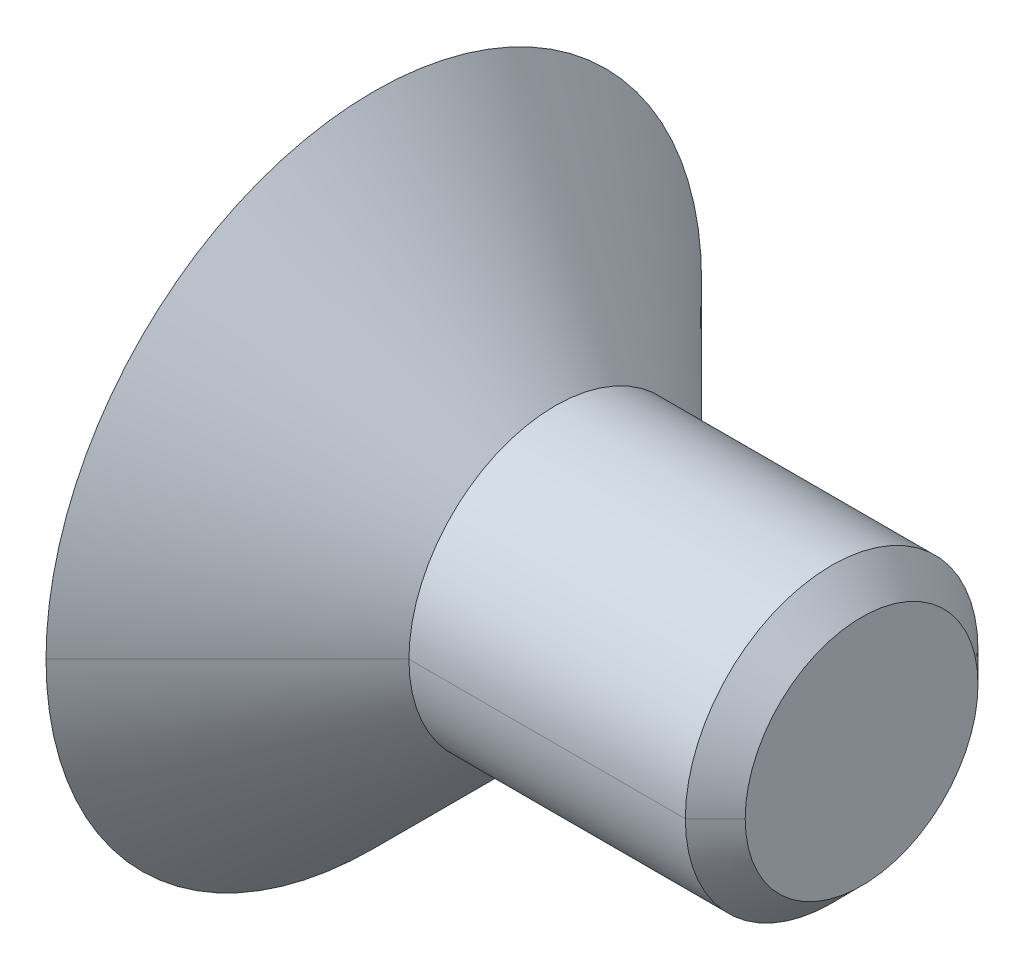
ISO-10303-21;
HEADER;
FILE_DESCRIPTION(('STEP AP214'),'2;1');
FILE_NAME('part.step','',(''),(''),'','','');
FILE_SCHEMA(('AUTOMOTIVE_DESIGN { 1 0 10303 214 1 1 1 1 }'));
ENDSEC;
DATA;
#1=APPLICATION_CONTEXT('core data for automotive mechanical design processes');
#2=APPLICATION_PROTOCOL_DEFINITION('international standard','automotive_design',2000,#1);
#3=PRODUCT_CONTEXT('',#1,'mechanical');
#4=PRODUCT('Part','Part','',(#3));
#5=PRODUCT_RELATED_PRODUCT_CATEGORY('part','',(#4));
#6=PRODUCT_DEFINITION_FORMATION('','',#4);
#7=PRODUCT_DEFINITION_CONTEXT('part definition',#1,'design');
#8=PRODUCT_DEFINITION('design','',#6,#7);
#9=PRODUCT_DEFINITION_SHAPE('','',#8);
#10=(LENGTH_UNIT() NAMED_UNIT(*) SI_UNIT(.MILLI.,.METRE.));
#11=(NAMED_UNIT(*) PLANE_ANGLE_UNIT() SI_UNIT($,.RADIAN.));
#12=(NAMED_UNIT(*) SI_UNIT($,.STERADIAN.) SOLID_ANGLE_UNIT());
#13=UNCERTAINTY_MEASURE_WITH_UNIT(LENGTH_MEASURE(1.E-05),#10,'distance_accuracy_value','');
#14=(GEOMETRIC_REPRESENTATION_CONTEXT(3) GLOBAL_UNCERTAINTY_ASSIGNED_CONTEXT((#13)) GLOBAL_UNIT_ASSIGNED_CONTEXT((#10,
#11,#12)) REPRESENTATION_CONTEXT('',''));
#15=CARTESIAN_POINT('',(0.,0.,0.));
#16=DIRECTION('',(0.,0.,1.));
#17=DIRECTION('',(1.,0.,0.));
#18=AXIS2_PLACEMENT_3D('',#15,#16,#17);
#19=CARTESIAN_POINT('',(0.,0.,0.));
#20=DIRECTION('',(1.,0.,0.));
#21=DIRECTION('',(0.,0.,-1.));
#22=AXIS2_PLACEMENT_3D('',#19,#20,#21);
#23=PLANE('',#22);
#24=CARTESIAN_POINT('',(0.,0.,0.));
#25=DIRECTION('',(1.,0.,0.));
#26=DIRECTION('',(0.,0.,-1.));
#27=AXIS2_PLACEMENT_3D('',#24,#25,#26);
#28=CIRCLE('',#27,6.72);
#29=CARTESIAN_POINT('',(0.,0.,6.72));
#30=VERTEX_POINT('',#29);
#31=CARTESIAN_POINT('',(0.,0.,-6.72));
#32=VERTEX_POINT('',#31);
#33=EDGE_CURVE('E11',#30,#32,#28,.T.);
#34=ORIENTED_EDGE('',*,*,#33,.F.);
#35=CARTESIAN_POINT('',(0.,0.,0.));
#36=DIRECTION('',(1.,0.,0.));
#37=DIRECTION('',(0.,0.,-1.));
#38=AXIS2_PLACEMENT_3D('',#35,#36,#37);
#39=CIRCLE('',#38,6.72);
#40=EDGE_CURVE('E25',#32,#30,#39,.T.);
#41=ORIENTED_EDGE('',*,*,#40,.F.);
#42=EDGE_LOOP('',(#34,#41));
#43=FACE_BOUND('',#42,.T.);
#44=DIRECTION('',(0.,0.499999999999983,-0.866025403784448));
#45=VECTOR('',#44,1.);
#46=CARTESIAN_POINT('',(0.,-2.3094010767585,0.));
#47=LINE('',#46,#45);
#48=CARTESIAN_POINT('',(0.,-2.3094010767585,0.));
#49=VERTEX_POINT('',#48);
#50=CARTESIAN_POINT('',(0.,-1.1547005383793,-2.));
#51=VERTEX_POINT('',#50);
#52=EDGE_CURVE('E311',#49,#51,#47,.T.);
#53=ORIENTED_EDGE('',*,*,#52,.T.);
#54=DIRECTION('',(0.,1.,0.));
#55=VECTOR('',#54,1.);
#56=CARTESIAN_POINT('',(0.,-1.1547005383793,-2.));
#57=LINE('',#56,#55);
#58=CARTESIAN_POINT('',(0.,1.1547005383793,-2.));
#59=VERTEX_POINT('',#58);
#60=EDGE_CURVE('E307',#51,#59,#57,.T.);
#61=ORIENTED_EDGE('',*,*,#60,.T.);
#62=DIRECTION('',(0.,0.499999999999983,0.866025403784448));
#63=VECTOR('',#62,1.);
#64=CARTESIAN_POINT('',(0.,1.1547005383793,-2.));
#65=LINE('',#64,#63);
#66=CARTESIAN_POINT('',(0.,2.3094010767585,0.));
#67=VERTEX_POINT('',#66);
#68=EDGE_CURVE('E303',#59,#67,#65,.T.);
#69=ORIENTED_EDGE('',*,*,#68,.T.);
#70=DIRECTION('',(0.,-0.499999999999983,0.866025403784448));
#71=VECTOR('',#70,1.);
#72=CARTESIAN_POINT('',(0.,2.3094010767585,0.));
#73=LINE('',#72,#71);
#74=CARTESIAN_POINT('',(0.,1.1547005383793,2.));
#75=VERTEX_POINT('',#74);
#76=EDGE_CURVE('E299',#67,#75,#73,.T.);
#77=ORIENTED_EDGE('',*,*,#76,.T.);
#78=DIRECTION('',(0.,-1.,0.));
#79=VECTOR('',#78,1.);
#80=CARTESIAN_POINT('',(0.,1.1547005383793,2.));
#81=LINE('',#80,#79);
#82=CARTESIAN_POINT('',(0.,-1.1547005383793,2.));
#83=VERTEX_POINT('',#82);
#84=EDGE_CURVE('E295',#75,#83,#81,.T.);
#85=ORIENTED_EDGE('',*,*,#84,.T.);
#86=DIRECTION('',(0.,-0.499999999999983,-0.866025403784448));
#87=VECTOR('',#86,1.);
#88=CARTESIAN_POINT('',(0.,-1.1547005383793,2.));
#89=LINE('',#88,#87);
#90=EDGE_CURVE('E291',#83,#49,#89,.T.);
#91=ORIENTED_EDGE('',*,*,#90,.T.);
#92=EDGE_LOOP('',(#53,#61,#69,#77,#85,#91));
#93=FACE_BOUND('',#92,.T.);
#94=ADVANCED_FACE('F17',(#43,#93),#23,.F.);
#95=CARTESIAN_POINT('',(2.2,-1.1547005383793,2.));
#96=DIRECTION('',(0.,0.866025403784449,-0.499999999999983));
#97=DIRECTION('',(0.,0.499999999999983,0.866025403784449));
#98=AXIS2_PLACEMENT_3D('',#95,#96,#97);
#99=PLANE('',#98);
#100=ORIENTED_EDGE('',*,*,#90,.F.);
#101=DIRECTION('',(-1.,0.,0.));
#102=VECTOR('',#101,1.);
#103=CARTESIAN_POINT('',(2.2,-1.1547005383793,2.));
#104=LINE('',#103,#102);
#105=CARTESIAN_POINT('',(2.2,-1.1547005383793,2.));
#106=VERTEX_POINT('',#105);
#107=EDGE_CURVE('E286',#106,#83,#104,.T.);
#108=ORIENTED_EDGE('',*,*,#107,.F.);
#109=DIRECTION('',(0.,-0.499999999999983,-0.866025403784448));
#110=VECTOR('',#109,1.);
#111=CARTESIAN_POINT('',(2.2,-1.1547005383793,2.));
#112=LINE('',#111,#110);
#113=CARTESIAN_POINT('',(2.2,-1.73205080756891,0.999999999999976));
#114=VERTEX_POINT('',#113);
#115=EDGE_CURVE('E282',#106,#114,#112,.T.);
#116=ORIENTED_EDGE('',*,*,#115,.T.);
#117=DIRECTION('',(0.,-0.499999999999983,-0.866025403784448));
#118=VECTOR('',#117,1.);
#119=CARTESIAN_POINT('',(2.2,-1.1547005383793,2.));
#120=LINE('',#119,#118);
#121=CARTESIAN_POINT('',(2.2,-2.3094010767585,0.));
#122=VERTEX_POINT('',#121);
#123=EDGE_CURVE('E278',#114,#122,#120,.T.);
#124=ORIENTED_EDGE('',*,*,#123,.T.);
#125=DIRECTION('',(-1.,0.,0.));
#126=VECTOR('',#125,1.);
#127=CARTESIAN_POINT('',(2.2,-2.3094010767585,0.));
#128=LINE('',#127,#126);
#129=EDGE_CURVE('E273',#122,#49,#128,.T.);
#130=ORIENTED_EDGE('',*,*,#129,.T.);
#131=EDGE_LOOP('',(#100,#108,#116,#124,#130));
#132=FACE_BOUND('',#131,.T.);
#133=ADVANCED_FACE('F343',(#132),#99,.T.);
#134=CARTESIAN_POINT('',(2.2,-2.3094010767585,0.));
#135=DIRECTION('',(0.,0.866025403784449,0.499999999999983));
#136=DIRECTION('',(0.,-0.499999999999983,0.866025403784449));
#137=AXIS2_PLACEMENT_3D('',#134,#135,#136);
#138=PLANE('',#137);
#139=ORIENTED_EDGE('',*,*,#52,.F.);
#140=ORIENTED_EDGE('',*,*,#129,.F.);
#141=DIRECTION('',(0.,0.499999999999983,-0.866025403784448));
#142=VECTOR('',#141,1.);
#143=CARTESIAN_POINT('',(2.2,-2.3094010767585,0.));
#144=LINE('',#143,#142);
#145=CARTESIAN_POINT('',(2.2,-1.73205080756889,-0.999999999999966));
#146=VERTEX_POINT('',#145);
#147=EDGE_CURVE('E269',#122,#146,#144,.T.);
#148=ORIENTED_EDGE('',*,*,#147,.T.);
#149=DIRECTION('',(0.,0.499999999999983,-0.866025403784448));
#150=VECTOR('',#149,1.);
#151=CARTESIAN_POINT('',(2.2,-2.3094010767585,0.));
#152=LINE('',#151,#150);
#153=CARTESIAN_POINT('',(2.2,-1.1547005383793,-2.));
#154=VERTEX_POINT('',#153);
#155=EDGE_CURVE('E265',#146,#154,#152,.T.);
#156=ORIENTED_EDGE('',*,*,#155,.T.);
#157=DIRECTION('',(-1.,0.,0.));
#158=VECTOR('',#157,1.);
#159=CARTESIAN_POINT('',(2.2,-1.1547005383793,-2.));
#160=LINE('',#159,#158);
#161=EDGE_CURVE('E260',#154,#51,#160,.T.);
#162=ORIENTED_EDGE('',*,*,#161,.T.);
#163=EDGE_LOOP('',(#139,#140,#148,#156,#162));
#164=FACE_BOUND('',#163,.T.);
#165=ADVANCED_FACE('F347',(#164),#138,.T.);
#166=CARTESIAN_POINT('',(2.2,-1.1547005383793,-2.));
#167=DIRECTION('',(0.,0.,1.));
#168=DIRECTION('',(1.,0.,0.));
#169=AXIS2_PLACEMENT_3D('',#166,#167,#168);
#170=PLANE('',#169);
#171=ORIENTED_EDGE('',*,*,#60,.F.);
#172=ORIENTED_EDGE('',*,*,#161,.F.);
#173=DIRECTION('',(0.,1.,0.));
#174=VECTOR('',#173,1.);
#175=CARTESIAN_POINT('',(2.2,-1.1547005383793,-2.));
#176=LINE('',#175,#174);
#177=CARTESIAN_POINT('',(2.2,0.,-2.));
#178=VERTEX_POINT('',#177);
#179=EDGE_CURVE('E256',#154,#178,#176,.T.);
#180=ORIENTED_EDGE('',*,*,#179,.T.);
#181=DIRECTION('',(0.,1.,0.));
#182=VECTOR('',#181,1.);
#183=CARTESIAN_POINT('',(2.2,-1.1547005383793,-2.));
#184=LINE('',#183,#182);
#185=CARTESIAN_POINT('',(2.2,1.1547005383793,-2.));
#186=VERTEX_POINT('',#185);
#187=EDGE_CURVE('E252',#178,#186,#184,.T.);
#188=ORIENTED_EDGE('',*,*,#187,.T.);
#189=DIRECTION('',(-1.,0.,0.));
#190=VECTOR('',#189,1.);
#191=CARTESIAN_POINT('',(2.2,1.1547005383793,-2.));
#192=LINE('',#191,#190);
#193=EDGE_CURVE('E247',#186,#59,#192,.T.);
#194=ORIENTED_EDGE('',*,*,#193,.T.);
#195=EDGE_LOOP('',(#171,#172,#180,#188,#194));
#196=FACE_BOUND('',#195,.T.);
#197=ADVANCED_FACE('F359',(#196),#170,.T.);
#198=CARTESIAN_POINT('',(2.2,1.1547005383793,-2.));
#199=DIRECTION('',(0.,-0.866025403784449,0.499999999999983));
#200=DIRECTION('',(0.,-0.499999999999983,-0.866025403784449));
#201=AXIS2_PLACEMENT_3D('',#198,#199,#200);
#202=PLANE('',#201);
#203=ORIENTED_EDGE('',*,*,#68,.F.);
#204=ORIENTED_EDGE('',*,*,#193,.F.);
#205=DIRECTION('',(0.,0.499999999999983,0.866025403784448));
#206=VECTOR('',#205,1.);
#207=CARTESIAN_POINT('',(2.2,1.1547005383793,-2.));
#208=LINE('',#207,#206);
#209=CARTESIAN_POINT('',(2.2,1.73205080756891,-0.999999999999976));
#210=VERTEX_POINT('',#209);
#211=EDGE_CURVE('E243',#186,#210,#208,.T.);
#212=ORIENTED_EDGE('',*,*,#211,.T.);
#213=DIRECTION('',(0.,0.499999999999983,0.866025403784448));
#214=VECTOR('',#213,1.);
#215=CARTESIAN_POINT('',(2.2,1.1547005383793,-2.));
#216=LINE('',#215,#214);
#217=CARTESIAN_POINT('',(2.2,2.3094010767585,0.));
#218=VERTEX_POINT('',#217);
#219=EDGE_CURVE('E239',#210,#218,#216,.T.);
#220=ORIENTED_EDGE('',*,*,#219,.T.);
#221=DIRECTION('',(-1.,0.,0.));
#222=VECTOR('',#221,1.);
#223=CARTESIAN_POINT('',(2.2,2.3094010767585,0.));
#224=LINE('',#223,#222);
#225=EDGE_CURVE('E234',#218,#67,#224,.T.);
#226=ORIENTED_EDGE('',*,*,#225,.T.);
#227=EDGE_LOOP('',(#203,#204,#212,#220,#226));
#228=FACE_BOUND('',#227,.T.);
#229=ADVANCED_FACE('F365',(#228),#202,.T.);
#230=CARTESIAN_POINT('',(2.2,2.3094010767585,0.));
#231=DIRECTION('',(0.,-0.866025403784449,-0.499999999999983));
#232=DIRECTION('',(0.,0.499999999999983,-0.866025403784449));
#233=AXIS2_PLACEMENT_3D('',#230,#231,#232);
#234=PLANE('',#233);
#235=ORIENTED_EDGE('',*,*,#76,.F.);
#236=ORIENTED_EDGE('',*,*,#225,.F.);
#237=DIRECTION('',(0.,-0.499999999999983,0.866025403784448));
#238=VECTOR('',#237,1.);
#239=CARTESIAN_POINT('',(2.2,2.3094010767585,0.));
#240=LINE('',#239,#238);
#241=CARTESIAN_POINT('',(2.2,1.73205080756891,0.999999999999976));
#242=VERTEX_POINT('',#241);
#243=EDGE_CURVE('E230',#218,#242,#240,.T.);
#244=ORIENTED_EDGE('',*,*,#243,.T.);
#245=DIRECTION('',(0.,-0.499999999999983,0.866025403784448));
#246=VECTOR('',#245,1.);
#247=CARTESIAN_POINT('',(2.2,2.3094010767585,0.));
#248=LINE('',#247,#246);
#249=CARTESIAN_POINT('',(2.2,1.1547005383793,2.));
#250=VERTEX_POINT('',#249);
#251=EDGE_CURVE('E226',#242,#250,#248,.T.);
#252=ORIENTED_EDGE('',*,*,#251,.T.);
#253=DIRECTION('',(-1.,0.,0.));
#254=VECTOR('',#253,1.);
#255=CARTESIAN_POINT('',(2.2,1.1547005383793,2.));
#256=LINE('',#255,#254);
#257=EDGE_CURVE('E221',#250,#75,#256,.T.);
#258=ORIENTED_EDGE('',*,*,#257,.T.);
#259=EDGE_LOOP('',(#235,#236,#244,#252,#258));
#260=FACE_BOUND('',#259,.T.);
#261=ADVANCED_FACE('F371',(#260),#234,.T.);
#262=CARTESIAN_POINT('',(2.2,1.1547005383793,2.));
#263=DIRECTION('',(0.,0.,-1.));
#264=DIRECTION('',(-1.,0.,0.));
#265=AXIS2_PLACEMENT_3D('',#262,#263,#264);
#266=PLANE('',#265);
#267=ORIENTED_EDGE('',*,*,#84,.F.);
#268=ORIENTED_EDGE('',*,*,#257,.F.);
#269=DIRECTION('',(0.,-1.,0.));
#270=VECTOR('',#269,1.);
#271=CARTESIAN_POINT('',(2.2,1.1547005383793,2.));
#272=LINE('',#271,#270);
#273=CARTESIAN_POINT('',(2.2,0.,2.));
#274=VERTEX_POINT('',#273);
#275=EDGE_CURVE('E217',#250,#274,#272,.T.);
#276=ORIENTED_EDGE('',*,*,#275,.T.);
#277=DIRECTION('',(0.,-1.,0.));
#278=VECTOR('',#277,1.);
#279=CARTESIAN_POINT('',(2.2,1.1547005383793,2.));
#280=LINE('',#279,#278);
#281=EDGE_CURVE('E212',#274,#106,#280,.T.);
#282=ORIENTED_EDGE('',*,*,#281,.T.);
#283=ORIENTED_EDGE('',*,*,#107,.T.);
#284=EDGE_LOOP('',(#267,#268,#276,#282,#283));
#285=FACE_BOUND('',#284,.T.);
#286=ADVANCED_FACE('F375',(#285),#266,.T.);
#287=CARTESIAN_POINT('',(2.2,0.,0.));
#288=DIRECTION('',(1.,0.,0.));
#289=DIRECTION('',(0.,0.,-1.));
#290=AXIS2_PLACEMENT_3D('',#287,#288,#289);
#291=PLANE('',#290);
#292=CARTESIAN_POINT('',(2.2,0.,0.));
#293=DIRECTION('',(1.,0.,0.));
#294=DIRECTION('',(0.,0.,-1.));
#295=AXIS2_PLACEMENT_3D('',#292,#293,#294);
#296=CIRCLE('',#295,2.);
#297=EDGE_CURVE('E207',#274,#114,#296,.T.);
#298=ORIENTED_EDGE('',*,*,#297,.T.);
#299=ORIENTED_EDGE('',*,*,#115,.F.);
#300=ORIENTED_EDGE('',*,*,#281,.F.);
#301=EDGE_LOOP('',(#298,#299,#300));
#302=FACE_BOUND('',#301,.T.);
#303=ADVANCED_FACE('F414',(#302),#291,.F.);
#304=CARTESIAN_POINT('',(2.2,0.,0.));
#305=DIRECTION('',(-1.,0.,0.));
#306=DIRECTION('',(0.,1.,0.));
#307=AXIS2_PLACEMENT_3D('',#304,#305,#306);
#308=CONICAL_SURFACE('',#307,2.,1.04719755119658);
#309=DIRECTION('',(-0.500000000000016,0.,-0.866025403784429));
#310=VECTOR('',#309,1.);
#311=CARTESIAN_POINT('',(3.3547005383793,0.,0.));
#312=LINE('',#311,#310);
#313=CARTESIAN_POINT('',(3.3547005383793,0.,0.));
#314=VERTEX_POINT('',#313);
#315=EDGE_CURVE('E202',#314,#178,#312,.T.);
#316=ORIENTED_EDGE('',*,*,#315,.T.);
#317=CARTESIAN_POINT('',(2.2,0.,0.));
#318=DIRECTION('',(1.,0.,0.));
#319=DIRECTION('',(0.,0.,-1.));
#320=AXIS2_PLACEMENT_3D('',#317,#318,#319);
#321=CIRCLE('',#320,2.);
#322=EDGE_CURVE('E197',#146,#178,#321,.T.);
#323=ORIENTED_EDGE('',*,*,#322,.F.);
#324=CARTESIAN_POINT('',(2.2,0.,0.));
#325=DIRECTION('',(1.,0.,0.));
#326=DIRECTION('',(0.,0.,-1.));
#327=AXIS2_PLACEMENT_3D('',#324,#325,#326);
#328=CIRCLE('',#327,2.);
#329=EDGE_CURVE('E192',#114,#146,#328,.T.);
#330=ORIENTED_EDGE('',*,*,#329,.F.);
#331=ORIENTED_EDGE('',*,*,#297,.F.);
#332=DIRECTION('',(-0.500000000000016,0.,0.866025403784429));
#333=VECTOR('',#332,1.);
#334=CARTESIAN_POINT('',(3.3547005383793,0.,0.));
#335=LINE('',#334,#333);
#336=EDGE_CURVE('E187',#314,#274,#335,.T.);
#337=ORIENTED_EDGE('',*,*,#336,.F.);
#338=EDGE_LOOP('',(#316,#323,#330,#331,#337));
#339=FACE_BOUND('',#338,.T.);
#340=ADVANCED_FACE('F384',(#339),#308,.F.);
#341=CARTESIAN_POINT('',(2.2,0.,0.));
#342=DIRECTION('',(-1.,0.,0.));
#343=DIRECTION('',(0.,-1.,0.));
#344=AXIS2_PLACEMENT_3D('',#341,#342,#343);
#345=CONICAL_SURFACE('',#344,2.,1.04719755119658);
#346=ORIENTED_EDGE('',*,*,#336,.T.);
#347=CARTESIAN_POINT('',(2.2,0.,0.));
#348=DIRECTION('',(1.,0.,0.));
#349=DIRECTION('',(0.,0.,-1.));
#350=AXIS2_PLACEMENT_3D('',#347,#348,#349);
#351=CIRCLE('',#350,2.);
#352=EDGE_CURVE('E182',#242,#274,#351,.T.);
#353=ORIENTED_EDGE('',*,*,#352,.F.);
#354=CARTESIAN_POINT('',(2.2,0.,0.));
#355=DIRECTION('',(1.,0.,0.));
#356=DIRECTION('',(0.,0.,-1.));
#357=AXIS2_PLACEMENT_3D('',#354,#355,#356);
#358=CIRCLE('',#357,2.);
#359=EDGE_CURVE('E177',#210,#242,#358,.T.);
#360=ORIENTED_EDGE('',*,*,#359,.F.);
#361=CARTESIAN_POINT('',(2.2,0.,0.));
#362=DIRECTION('',(1.,0.,0.));
#363=DIRECTION('',(0.,0.,-1.));
#364=AXIS2_PLACEMENT_3D('',#361,#362,#363);
#365=CIRCLE('',#364,2.);
#366=EDGE_CURVE('E172',#178,#210,#365,.T.);
#367=ORIENTED_EDGE('',*,*,#366,.F.);
#368=ORIENTED_EDGE('',*,*,#315,.F.);
#369=EDGE_LOOP('',(#346,#353,#360,#367,#368));
#370=FACE_BOUND('',#369,.T.);
#371=ADVANCED_FACE('F407',(#370),#345,.F.);
#372=CARTESIAN_POINT('',(2.2,0.,0.));
#373=DIRECTION('',(1.,0.,0.));
#374=DIRECTION('',(0.,0.,-1.));
#375=AXIS2_PLACEMENT_3D('',#372,#373,#374);
#376=PLANE('',#375);
#377=ORIENTED_EDGE('',*,*,#366,.T.);
#378=ORIENTED_EDGE('',*,*,#211,.F.);
#379=ORIENTED_EDGE('',*,*,#187,.F.);
#380=EDGE_LOOP('',(#377,#378,#379));
#381=FACE_BOUND('',#380,.T.);
#382=ADVANCED_FACE('F403',(#381),#376,.F.);
#383=CARTESIAN_POINT('',(2.2,0.,0.));
#384=DIRECTION('',(1.,0.,0.));
#385=DIRECTION('',(0.,0.,-1.));
#386=AXIS2_PLACEMENT_3D('',#383,#384,#385);
#387=PLANE('',#386);
#388=ORIENTED_EDGE('',*,*,#219,.F.);
#389=ORIENTED_EDGE('',*,*,#359,.T.);
#390=ORIENTED_EDGE('',*,*,#243,.F.);
#391=EDGE_LOOP('',(#388,#389,#390));
#392=FACE_BOUND('',#391,.T.);
#393=ADVANCED_FACE('F397',(#392),#387,.F.);
#394=CARTESIAN_POINT('',(2.2,0.,0.));
#395=DIRECTION('',(1.,0.,0.));
#396=DIRECTION('',(0.,0.,-1.));
#397=AXIS2_PLACEMENT_3D('',#394,#395,#396);
#398=PLANE('',#397);
#399=ORIENTED_EDGE('',*,*,#352,.T.);
#400=ORIENTED_EDGE('',*,*,#275,.F.);
#401=ORIENTED_EDGE('',*,*,#251,.F.);
#402=EDGE_LOOP('',(#399,#400,#401));
#403=FACE_BOUND('',#402,.T.);
#404=ADVANCED_FACE('F390',(#403),#398,.F.);
#405=CARTESIAN_POINT('',(2.2,0.,0.));
#406=DIRECTION('',(1.,0.,0.));
#407=DIRECTION('',(0.,0.,-1.));
#408=AXIS2_PLACEMENT_3D('',#405,#406,#407);
#409=PLANE('',#408);
#410=ORIENTED_EDGE('',*,*,#329,.T.);
#411=ORIENTED_EDGE('',*,*,#147,.F.);
#412=ORIENTED_EDGE('',*,*,#123,.F.);
#413=EDGE_LOOP('',(#410,#411,#412));
#414=FACE_BOUND('',#413,.T.);
#415=ADVANCED_FACE('F388',(#414),#409,.F.);
#416=CARTESIAN_POINT('',(2.2,0.,0.));
#417=DIRECTION('',(1.,0.,0.));
#418=DIRECTION('',(0.,0.,-1.));
#419=AXIS2_PLACEMENT_3D('',#416,#417,#418);
#420=PLANE('',#419);
#421=ORIENTED_EDGE('',*,*,#322,.T.);
#422=ORIENTED_EDGE('',*,*,#179,.F.);
#423=ORIENTED_EDGE('',*,*,#155,.F.);
#424=EDGE_LOOP('',(#421,#422,#423));
#425=FACE_BOUND('',#424,.T.);
#426=ADVANCED_FACE('F340',(#425),#420,.F.);
#427=CARTESIAN_POINT('',(0.,0.,0.));
#428=DIRECTION('',(-1.,0.,0.));
#429=DIRECTION('',(0.,-1.,0.));
#430=AXIS2_PLACEMENT_3D('',#427,#428,#429);
#431=CONICAL_SURFACE('',#430,6.72,0.785398163397448);
#432=DIRECTION('',(-0.707106781186548,0.,-0.707106781186547));
#433=VECTOR('',#432,1.);
#434=CARTESIAN_POINT('',(3.72,0.,-3.));
#435=LINE('',#434,#433);
#436=CARTESIAN_POINT('',(3.72,0.,-3.));
#437=VERTEX_POINT('',#436);
#438=EDGE_CURVE('E167',#437,#32,#435,.T.);
#439=ORIENTED_EDGE('',*,*,#438,.T.);
#440=ORIENTED_EDGE('',*,*,#40,.T.);
#441=DIRECTION('',(-0.707106781186548,0.,0.707106781186547));
#442=VECTOR('',#441,1.);
#443=CARTESIAN_POINT('',(3.72,0.,3.));
#444=LINE('',#443,#442);
#445=CARTESIAN_POINT('',(3.72,0.,3.));
#446=VERTEX_POINT('',#445);
#447=EDGE_CURVE('E162',#446,#30,#444,.T.);
#448=ORIENTED_EDGE('',*,*,#447,.F.);
#449=CARTESIAN_POINT('',(3.72,0.,0.));
#450=DIRECTION('',(1.,0.,0.));
#451=DIRECTION('',(0.,0.,-1.));
#452=AXIS2_PLACEMENT_3D('',#449,#450,#451);
#453=CIRCLE('',#452,3.);
#454=EDGE_CURVE('E157',#437,#446,#453,.T.);
#455=ORIENTED_EDGE('',*,*,#454,.F.);
#456=EDGE_LOOP('',(#439,#440,#448,#455));
#457=FACE_BOUND('',#456,.T.);
#458=ADVANCED_FACE('F320',(#457),#431,.T.);
#459=CARTESIAN_POINT('',(10.,0.,0.));
#460=DIRECTION('',(1.,0.,0.));
#461=DIRECTION('',(0.,-1.,0.));
#462=AXIS2_PLACEMENT_3D('',#459,#460,#461);
#463=CYLINDRICAL_SURFACE('',#462,3.);
#464=DIRECTION('',(1.,0.,0.));
#465=VECTOR('',#464,1.);
#466=CARTESIAN_POINT('',(3.72,0.,3.));
#467=LINE('',#466,#465);
#468=CARTESIAN_POINT('',(9.3865,0.,3.));
#469=VERTEX_POINT('',#468);
#470=EDGE_CURVE('E153',#446,#469,#467,.T.);
#471=ORIENTED_EDGE('',*,*,#470,.T.);
#472=CARTESIAN_POINT('',(9.3865,0.,0.));
#473=DIRECTION('',(1.,0.,0.));
#474=DIRECTION('',(0.,0.,-1.));
#475=AXIS2_PLACEMENT_3D('',#472,#473,#474);
#476=CIRCLE('',#475,3.);
#477=CARTESIAN_POINT('',(9.3865,0.,-3.));
#478=VERTEX_POINT('',#477);
#479=EDGE_CURVE('E126',#478,#469,#476,.T.);
#480=ORIENTED_EDGE('',*,*,#479,.F.);
#481=DIRECTION('',(1.,0.,0.));
#482=VECTOR('',#481,1.);
#483=CARTESIAN_POINT('',(3.72,0.,-3.));
#484=LINE('',#483,#482);
#485=EDGE_CURVE('E145',#437,#478,#484,.T.);
#486=ORIENTED_EDGE('',*,*,#485,.F.);
#487=ORIENTED_EDGE('',*,*,#454,.T.);
#488=EDGE_LOOP('',(#471,#480,#486,#487));
#489=FACE_BOUND('',#488,.T.);
#490=ADVANCED_FACE('F331',(#489),#463,.T.);
#491=CARTESIAN_POINT('',(10.,0.,0.));
#492=DIRECTION('',(1.,0.,0.));
#493=DIRECTION('',(0.,1.,-1.61702901641324E-09));
#494=AXIS2_PLACEMENT_3D('',#491,#492,#493);
#495=CYLINDRICAL_SURFACE('',#494,3.);
#496=ORIENTED_EDGE('',*,*,#470,.F.);
#497=CARTESIAN_POINT('',(3.72,0.,0.));
#498=DIRECTION('',(1.,0.,0.));
#499=DIRECTION('',(0.,0.,-1.));
#500=AXIS2_PLACEMENT_3D('',#497,#498,#499);
#501=CIRCLE('',#500,3.);
#502=EDGE_CURVE('E140',#446,#437,#501,.T.);
#503=ORIENTED_EDGE('',*,*,#502,.T.);
#504=ORIENTED_EDGE('',*,*,#485,.T.);
#505=CARTESIAN_POINT('',(9.3865,0.,0.));
#506=DIRECTION('',(1.,0.,0.));
#507=DIRECTION('',(0.,0.,-1.));
#508=AXIS2_PLACEMENT_3D('',#505,#506,#507);
#509=CIRCLE('',#508,3.);
#510=EDGE_CURVE('E136',#469,#478,#509,.T.);
#511=ORIENTED_EDGE('',*,*,#510,.F.);
#512=EDGE_LOOP('',(#496,#503,#504,#511));
#513=FACE_BOUND('',#512,.T.);
#514=ADVANCED_FACE('F329',(#513),#495,.T.);
#515=CARTESIAN_POINT('',(9.3865,0.,0.));
#516=DIRECTION('',(-1.,0.,0.));
#517=DIRECTION('',(0.,1.,0.));
#518=AXIS2_PLACEMENT_3D('',#515,#516,#517);
#519=CONICAL_SURFACE('',#518,3.,0.785398163397449);
#520=DIRECTION('',(-0.707106781186547,0.,-0.707106781186548));
#521=VECTOR('',#520,1.);
#522=CARTESIAN_POINT('',(10.,0.,-2.3865));
#523=LINE('',#522,#521);
#524=CARTESIAN_POINT('',(10.,0.,-2.3865));
#525=VERTEX_POINT('',#524);
#526=EDGE_CURVE('E117',#525,#478,#523,.T.);
#527=ORIENTED_EDGE('',*,*,#526,.F.);
#528=CARTESIAN_POINT('',(10.,0.,0.));
#529=DIRECTION('',(1.,0.,0.));
#530=DIRECTION('',(0.,0.,-1.));
#531=AXIS2_PLACEMENT_3D('',#528,#529,#530);
#532=CIRCLE('',#531,2.3865);
#533=CARTESIAN_POINT('',(10.,0.,2.3865));
#534=VERTEX_POINT('',#533);
#535=EDGE_CURVE('E109',#534,#525,#532,.T.);
#536=ORIENTED_EDGE('',*,*,#535,.F.);
#537=DIRECTION('',(-0.707106781186547,0.,0.707106781186548));
#538=VECTOR('',#537,1.);
#539=CARTESIAN_POINT('',(10.,0.,2.3865));
#540=LINE('',#539,#538);
#541=EDGE_CURVE('E114',#534,#469,#540,.T.);
#542=ORIENTED_EDGE('',*,*,#541,.T.);
#543=ORIENTED_EDGE('',*,*,#510,.T.);
#544=EDGE_LOOP('',(#527,#536,#542,#543));
#545=FACE_BOUND('',#544,.T.);
#546=ADVANCED_FACE('F111',(#545),#519,.T.);
#547=CARTESIAN_POINT('',(9.3865,0.,0.));
#548=DIRECTION('',(-1.,0.,0.));
#549=DIRECTION('',(0.,-1.,0.));
#550=AXIS2_PLACEMENT_3D('',#547,#548,#549);
#551=CONICAL_SURFACE('',#550,3.,0.785398163397449);
#552=ORIENTED_EDGE('',*,*,#526,.T.);
#553=ORIENTED_EDGE('',*,*,#479,.T.);
#554=ORIENTED_EDGE('',*,*,#541,.F.);
#555=CARTESIAN_POINT('',(10.,0.,0.));
#556=DIRECTION('',(1.,0.,0.));
#557=DIRECTION('',(0.,0.,-1.));
#558=AXIS2_PLACEMENT_3D('',#555,#556,#557);
#559=CIRCLE('',#558,2.3865);
#560=EDGE_CURVE('E121',#525,#534,#559,.T.);
#561=ORIENTED_EDGE('',*,*,#560,.F.);
#562=EDGE_LOOP('',(#552,#553,#554,#561));
#563=FACE_BOUND('',#562,.T.);
#564=ADVANCED_FACE('F125',(#563),#551,.T.);
#565=CARTESIAN_POINT('',(10.,2.3865,0.));
#566=DIRECTION('',(-1.,0.,0.));
#567=DIRECTION('',(0.,0.,1.));
#568=AXIS2_PLACEMENT_3D('',#565,#566,#567);
#569=PLANE('',#568);
#570=ORIENTED_EDGE('',*,*,#560,.T.);
#571=ORIENTED_EDGE('',*,*,#535,.T.);
#572=EDGE_LOOP('',(#570,#571));
#573=FACE_BOUND('',#572,.T.);
#574=ADVANCED_FACE('F122',(#573),#569,.F.);
#575=CARTESIAN_POINT('',(0.,0.,0.));
#576=DIRECTION('',(-1.,0.,0.));
#577=DIRECTION('',(0.,1.,0.));
#578=AXIS2_PLACEMENT_3D('',#575,#576,#577);
#579=CONICAL_SURFACE('',#578,6.72,0.785398163397448);
#580=ORIENTED_EDGE('',*,*,#438,.F.);
#581=ORIENTED_EDGE('',*,*,#502,.F.);
#582=ORIENTED_EDGE('',*,*,#447,.T.);
#583=ORIENTED_EDGE('',*,*,#33,.T.);
#584=EDGE_LOOP('',(#580,#581,#582,#583));
#585=FACE_BOUND('',#584,.T.);
#586=ADVANCED_FACE('F324',(#585),#579,.T.);
#587=CLOSED_SHELL('',(#94,#133,#165,#197,#229,#261,#286,#303,#340,#371,#382,#393,#404,#415,#426,
#458,#490,#514,#546,#564,#574,#586));
#588=MANIFOLD_SOLID_BREP('B1',#587);
#589=ADVANCED_BREP_SHAPE_REPRESENTATION('',(#18,#588),#14);
#590=SHAPE_DEFINITION_REPRESENTATION(#9,#589);
ENDSEC;
END-ISO-10303-21;
